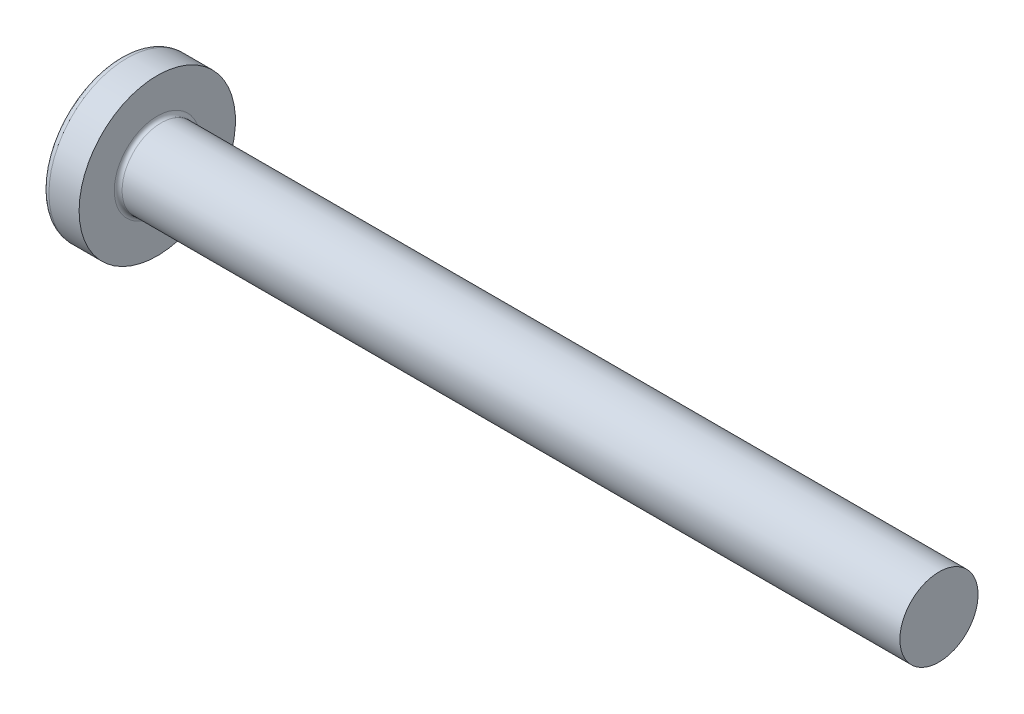
ISO-10303-21;
HEADER;
FILE_DESCRIPTION(('STEP AP214'),'2;1');
FILE_NAME('part.step','',(''),(''),'','','');
FILE_SCHEMA(('AUTOMOTIVE_DESIGN { 1 0 10303 214 1 1 1 1 }'));
ENDSEC;
DATA;
#1=APPLICATION_CONTEXT('core data for automotive mechanical design processes');
#2=APPLICATION_PROTOCOL_DEFINITION('international standard','automotive_design',2000,#1);
#3=PRODUCT_CONTEXT('',#1,'mechanical');
#4=PRODUCT('Part','Part','',(#3));
#5=PRODUCT_RELATED_PRODUCT_CATEGORY('part','',(#4));
#6=PRODUCT_DEFINITION_FORMATION('','',#4);
#7=PRODUCT_DEFINITION_CONTEXT('part definition',#1,'design');
#8=PRODUCT_DEFINITION('design','',#6,#7);
#9=PRODUCT_DEFINITION_SHAPE('','',#8);
#10=(LENGTH_UNIT() NAMED_UNIT(*) SI_UNIT(.MILLI.,.METRE.));
#11=(NAMED_UNIT(*) PLANE_ANGLE_UNIT() SI_UNIT($,.RADIAN.));
#12=(NAMED_UNIT(*) SI_UNIT($,.STERADIAN.) SOLID_ANGLE_UNIT());
#13=UNCERTAINTY_MEASURE_WITH_UNIT(LENGTH_MEASURE(1.E-05),#10,'distance_accuracy_value','');
#14=(GEOMETRIC_REPRESENTATION_CONTEXT(3) GLOBAL_UNCERTAINTY_ASSIGNED_CONTEXT((#13)) GLOBAL_UNIT_ASSIGNED_CONTEXT((#10,
#11,#12)) REPRESENTATION_CONTEXT('',''));
#15=CARTESIAN_POINT('',(0.,0.,0.));
#16=DIRECTION('',(0.,0.,1.));
#17=DIRECTION('',(1.,0.,0.));
#18=AXIS2_PLACEMENT_3D('',#15,#16,#17);
#19=CARTESIAN_POINT('',(6.5,0.,0.));
#20=DIRECTION('',(-1.,0.,0.));
#21=DIRECTION('',(0.,1.,0.));
#22=AXIS2_PLACEMENT_3D('',#19,#20,#21);
#23=SPHERICAL_SURFACE('',#22,6.5);
#24=CARTESIAN_POINT('',(1.26538895452803,0.,0.));
#25=DIRECTION('',(-1.,0.,0.));
#26=DIRECTION('',(0.,0.,1.));
#27=AXIS2_PLACEMENT_3D('',#24,#25,#26);
#28=CIRCLE('',#27,3.85342019543974);
#29=CARTESIAN_POINT('',(1.26538895452803,0.,3.85342019543974));
#30=VERTEX_POINT('',#29);
#31=EDGE_CURVE('E215',#30,#30,#28,.T.);
#32=ORIENTED_EDGE('',*,*,#31,.T.);
#33=EDGE_LOOP('',(#32));
#34=FACE_BOUND('',#33,.T.);
#35=CARTESIAN_POINT('',(0.0788099820016241,0.,0.));
#36=DIRECTION('',(1.,0.,0.));
#37=DIRECTION('',(0.,0.,-1.));
#38=AXIS2_PLACEMENT_3D('',#35,#36,#37);
#39=CIRCLE('',#38,1.0091178091571);
#40=CARTESIAN_POINT('',(0.0788099820016244,-0.514999999999996,-0.867809744562728));
#41=VERTEX_POINT('',#40);
#42=CARTESIAN_POINT('',(0.0788099820016241,-0.867809744562729,-0.515));
#43=VERTEX_POINT('',#42);
#44=EDGE_CURVE('E342',#41,#43,#39,.F.);
#45=ORIENTED_EDGE('',*,*,#44,.F.);
#46=CARTESIAN_POINT('',(6.5,-0.515000000000001,0.));
#47=DIRECTION('',(0.,1.,0.));
#48=DIRECTION('',(0.,0.,1.));
#49=AXIS2_PLACEMENT_3D('',#46,#47,#48);
#50=CIRCLE('',#49,6.47956595768575);
#51=CARTESIAN_POINT('',(0.331830520157854,-0.514999999999992,-1.98455543332603));
#52=VERTEX_POINT('',#51);
#53=EDGE_CURVE('E275',#52,#41,#50,.T.);
#54=ORIENTED_EDGE('',*,*,#53,.F.);
#55=CARTESIAN_POINT('',(6.06443225879603,0.,0.873613881878153));
#56=DIRECTION('',(0.446197753347436,0.,-0.894934391398443));
#57=DIRECTION('',(-0.894934391398442,0.,-0.446197753347436));
#58=AXIS2_PLACEMENT_3D('',#55,#56,#57);
#59=CIRCLE('',#58,6.42628038045433);
#60=CARTESIAN_POINT('',(0.331830520157856,0.515000000000007,-1.98455543332603));
#61=VERTEX_POINT('',#60);
#62=EDGE_CURVE('E249',#52,#61,#59,.T.);
#63=ORIENTED_EDGE('',*,*,#62,.T.);
#64=CARTESIAN_POINT('',(6.5,0.515,0.));
#65=DIRECTION('',(0.,-1.,0.));
#66=DIRECTION('',(0.,0.,-1.));
#67=AXIS2_PLACEMENT_3D('',#64,#65,#66);
#68=CIRCLE('',#67,6.47956595768574);
#69=CARTESIAN_POINT('',(0.0788099820016249,0.515000000000003,-0.867809744562724));
#70=VERTEX_POINT('',#69);
#71=EDGE_CURVE('E304',#70,#61,#68,.T.);
#72=ORIENTED_EDGE('',*,*,#71,.F.);
#73=CARTESIAN_POINT('',(0.0788099820016241,0.867809744562719,-0.515));
#74=VERTEX_POINT('',#73);
#75=EDGE_CURVE('E357',#74,#70,#39,.F.);
#76=ORIENTED_EDGE('',*,*,#75,.F.);
#77=CARTESIAN_POINT('',(6.5,0.,-0.515));
#78=DIRECTION('',(0.,0.,1.));
#79=DIRECTION('',(1.,0.,0.));
#80=AXIS2_PLACEMENT_3D('',#77,#78,#79);
#81=CIRCLE('',#80,6.47956595768574);
#82=CARTESIAN_POINT('',(0.331830520157856,1.98455543332603,-0.515));
#83=VERTEX_POINT('',#82);
#84=EDGE_CURVE('E243',#83,#74,#81,.T.);
#85=ORIENTED_EDGE('',*,*,#84,.F.);
#86=CARTESIAN_POINT('',(6.06443225879604,-0.873613881878154,0.));
#87=DIRECTION('',(0.446197753347436,0.894934391398443,0.));
#88=DIRECTION('',(-0.894934391398442,0.446197753347436,0.));
#89=AXIS2_PLACEMENT_3D('',#86,#87,#88);
#90=CIRCLE('',#89,6.42628038045433);
#91=CARTESIAN_POINT('',(0.331830520157857,1.98455543332603,0.515));
#92=VERTEX_POINT('',#91);
#93=EDGE_CURVE('E246',#83,#92,#90,.T.);
#94=ORIENTED_EDGE('',*,*,#93,.T.);
#95=CARTESIAN_POINT('',(6.5,0.,0.515000000000001));
#96=DIRECTION('',(0.,0.,-1.));
#97=DIRECTION('',(-1.,0.,0.));
#98=AXIS2_PLACEMENT_3D('',#95,#96,#97);
#99=CIRCLE('',#98,6.47956595768574);
#100=CARTESIAN_POINT('',(0.0788099820016241,0.867809744562719,0.514999999999999));
#101=VERTEX_POINT('',#100);
#102=EDGE_CURVE('E239',#101,#92,#99,.T.);
#103=ORIENTED_EDGE('',*,*,#102,.F.);
#104=CARTESIAN_POINT('',(0.0788099820016253,0.514999999999997,0.867809744562727));
#105=VERTEX_POINT('',#104);
#106=EDGE_CURVE('E356',#105,#101,#39,.F.);
#107=ORIENTED_EDGE('',*,*,#106,.F.);
#108=CARTESIAN_POINT('',(0.331830520157856,0.514999999999993,1.98455543332603));
#109=VERTEX_POINT('',#108);
#110=EDGE_CURVE('E259',#109,#105,#68,.T.);
#111=ORIENTED_EDGE('',*,*,#110,.F.);
#112=CARTESIAN_POINT('',(6.06443225879603,0.,-0.873613881878153));
#113=DIRECTION('',(0.446197753347436,0.,0.894934391398443));
#114=DIRECTION('',(0.894934391398442,0.,-0.446197753347436));
#115=AXIS2_PLACEMENT_3D('',#112,#113,#114);
#116=CIRCLE('',#115,6.42628038045433);
#117=CARTESIAN_POINT('',(0.331830520157855,-0.515000000000007,1.98455543332603));
#118=VERTEX_POINT('',#117);
#119=EDGE_CURVE('E50',#109,#118,#116,.T.);
#120=ORIENTED_EDGE('',*,*,#119,.T.);
#121=CARTESIAN_POINT('',(0.0788099820016247,-0.515000000000003,0.867809744562724));
#122=VERTEX_POINT('',#121);
#123=EDGE_CURVE('E256',#122,#118,#50,.T.);
#124=ORIENTED_EDGE('',*,*,#123,.F.);
#125=CARTESIAN_POINT('',(0.0788099820016241,-0.867809744562729,0.514999999999999));
#126=VERTEX_POINT('',#125);
#127=EDGE_CURVE('E392',#126,#122,#39,.F.);
#128=ORIENTED_EDGE('',*,*,#127,.F.);
#129=CARTESIAN_POINT('',(0.331830520157853,-1.98455543332603,0.514999999999999));
#130=VERTEX_POINT('',#129);
#131=EDGE_CURVE('E240',#130,#126,#99,.T.);
#132=ORIENTED_EDGE('',*,*,#131,.F.);
#133=CARTESIAN_POINT('',(6.06443225879603,0.873613881878152,0.));
#134=DIRECTION('',(0.446197753347436,-0.894934391398443,0.));
#135=DIRECTION('',(0.894934391398442,0.446197753347436,0.));
#136=AXIS2_PLACEMENT_3D('',#133,#134,#135);
#137=CIRCLE('',#136,6.42628038045433);
#138=CARTESIAN_POINT('',(0.331830520157853,-1.98455543332603,-0.515));
#139=VERTEX_POINT('',#138);
#140=EDGE_CURVE('E236',#130,#139,#137,.T.);
#141=ORIENTED_EDGE('',*,*,#140,.T.);
#142=EDGE_CURVE('E65',#43,#139,#81,.T.);
#143=ORIENTED_EDGE('',*,*,#142,.F.);
#144=EDGE_LOOP('',(#45,#54,#63,#72,#76,#85,#94,#103,#107,#111,#120,#124,#128,#132,#141,#143));
#145=FACE_BOUND('',#144,.T.);
#146=ADVANCED_FACE('F36',(#34,#145),#23,.T.);
#147=CARTESIAN_POINT('',(0.,2.15,-0.515));
#148=DIRECTION('',(0.,0.,1.));
#149=DIRECTION('',(1.,0.,0.));
#150=AXIS2_PLACEMENT_3D('',#147,#148,#149);
#151=PLANE('',#150);
#152=ORIENTED_EDGE('',*,*,#84,.T.);
#153=CARTESIAN_POINT('',(-1.51195208675156,0.994972220320188,-0.515));
#154=CARTESIAN_POINT('',(-1.20405981949279,0.970722016949958,-0.515));
#155=CARTESIAN_POINT('',(-0.896180907521174,0.946299109919651,-0.515));
#156=CARTESIAN_POINT('',(-0.280449079832185,0.896981122427851,-0.515));
#157=CARTESIAN_POINT('',(0.0274038344396873,0.872086023934883,-0.515));
#158=CARTESIAN_POINT('',(0.489146739515351,0.83429553519528,-0.515));
#159=CARTESIAN_POINT('',(0.643055047553846,0.821624058404092,-0.515));
#160=CARTESIAN_POINT('',(0.950856520197141,0.796108332639504,-0.515));
#161=CARTESIAN_POINT('',(1.10474968487868,0.783264084592465,-0.515));
#162=CARTESIAN_POINT('',(1.41251352095103,0.757376569093378,-0.515));
#163=CARTESIAN_POINT('',(1.56638419296577,0.744333309065218,-0.515));
#164=CARTESIAN_POINT('',(1.87410847343335,0.718013273188896,-0.515));
#165=CARTESIAN_POINT('',(2.02796208151372,0.704736492982792,-0.515));
#166=CARTESIAN_POINT('',(2.36455311890989,0.675386943006726,-0.515));
#167=CARTESIAN_POINT('',(2.54728562293342,0.659257575640986,-0.515));
#168=CARTESIAN_POINT('',(2.91270624109256,0.626517182479888,-0.515));
#169=CARTESIAN_POINT('',(3.09539435554038,0.609906160177238,-0.515));
#170=CARTESIAN_POINT('',(3.46069832191612,0.576073027116421,-0.515));
#171=CARTESIAN_POINT('',(3.64331417870068,0.558850968932727,-0.515));
#172=CARTESIAN_POINT('',(4.00847437496567,0.523604864540037,-0.515));
#173=CARTESIAN_POINT('',(4.19101871216888,0.505580794604253,-0.515));
#174=CARTESIAN_POINT('',(4.55606208157937,0.468429191666488,-0.515));
#175=CARTESIAN_POINT('',(4.73856107358022,0.449301262281854,-0.515));
#176=CARTESIAN_POINT('',(5.10337547353418,0.409473604748924,-0.515));
#177=CARTESIAN_POINT('',(5.28569089526422,0.388774005106069,-0.515));
#178=CARTESIAN_POINT('',(5.55897278495412,0.355828287527264,-0.515));
#179=CARTESIAN_POINT('',(5.65005277419686,0.344527918782738,-0.515));
#180=CARTESIAN_POINT('',(5.83209904103607,0.321075174263031,-0.515));
#181=CARTESIAN_POINT('',(5.92306532397915,0.308922840209686,-0.515));
#182=CARTESIAN_POINT('',(6.10486078872898,0.28342733445193,-0.515));
#183=CARTESIAN_POINT('',(6.19568992299379,0.270083817601714,-0.515));
#184=CARTESIAN_POINT('',(6.33172773785679,0.248701420809951,-0.515));
#185=CARTESIAN_POINT('',(6.37704304473344,0.241345446705304,-0.515));
#186=CARTESIAN_POINT('',(6.4675722520141,0.226018953559337,-0.515));
#187=CARTESIAN_POINT('',(6.51278614568083,0.218048394864476,-0.515));
#188=CARTESIAN_POINT('',(6.55793125759548,0.209691465274944,-0.515));
#189=B_SPLINE_CURVE_WITH_KNOTS('',3,(#153,#154,#155,#156,#157,#158,#159,#160,#161,#162,#163,
#164,#165,#166,#167,#168,#169,#170,#171,#172,#173,#174,#175,#176,#177,#178,#179,#180,#181,#182,
#183,#184,#185,#186,#187,#188),.UNSPECIFIED.,.F.,.F.,(4,2,2,2,2,2,2,2,2,2,2,2,2,2,2,2,2,4),(0.,
0.926537709781721,1.85311087258339,2.31639796016285,2.77968256468771,3.24294992902055,
3.70622594801777,4.25655436065378,4.80687878359543,5.35715597005738,5.90744944680718,
6.45794177197673,7.008389135274,7.28372117336898,7.55903973750591,7.83443833587748,
7.97216007460854,8.10989070671571),.UNSPECIFIED.);
#190=CARTESIAN_POINT('',(2.34,0.677477674908923,-0.515));
#191=VERTEX_POINT('',#190);
#192=EDGE_CURVE('E379',#74,#191,#189,.T.);
#193=ORIENTED_EDGE('',*,*,#192,.T.);
#194=DIRECTION('',(0.,1.,0.));
#195=VECTOR('',#194,1.);
#196=CARTESIAN_POINT('',(2.34,-0.983319232260742,-0.515));
#197=LINE('',#196,#195);
#198=CARTESIAN_POINT('',(2.34,0.983319232260743,-0.515));
#199=VERTEX_POINT('',#198);
#200=EDGE_CURVE('E325',#191,#199,#197,.T.);
#201=ORIENTED_EDGE('',*,*,#200,.T.);
#202=DIRECTION('',(0.894934391398442,-0.446197753347436,0.));
#203=VECTOR('',#202,1.);
#204=CARTESIAN_POINT('',(0.,2.15,-0.515));
#205=LINE('',#204,#203);
#206=EDGE_CURVE('E216',#83,#199,#205,.T.);
#207=ORIENTED_EDGE('',*,*,#206,.F.);
#208=EDGE_LOOP('',(#152,#193,#201,#207));
#209=FACE_BOUND('',#208,.T.);
#210=ADVANCED_FACE('F171',(#209),#151,.T.);
#211=CARTESIAN_POINT('',(2.34,-0.983319232260742,-0.515));
#212=VERTEX_POINT('',#211);
#213=CARTESIAN_POINT('',(2.34,-0.677477674908923,-0.515));
#214=VERTEX_POINT('',#213);
#215=EDGE_CURVE('E224',#212,#214,#197,.T.);
#216=ORIENTED_EDGE('',*,*,#215,.T.);
#217=CARTESIAN_POINT('',(-1.51195208675156,-0.994972220320188,-0.515));
#218=CARTESIAN_POINT('',(-1.20405981949279,-0.970722016949958,-0.515));
#219=CARTESIAN_POINT('',(-0.896180907521174,-0.946299109919651,-0.515));
#220=CARTESIAN_POINT('',(-0.280449079832185,-0.896981122427851,-0.515));
#221=CARTESIAN_POINT('',(0.027403834439687,-0.872086023934883,-0.515));
#222=CARTESIAN_POINT('',(0.48914673951535,-0.83429553519528,-0.515));
#223=CARTESIAN_POINT('',(0.643055047553845,-0.821624058404092,-0.515));
#224=CARTESIAN_POINT('',(0.95085652019714,-0.796108332639504,-0.515));
#225=CARTESIAN_POINT('',(1.10474968487868,-0.783264084592466,-0.515));
#226=CARTESIAN_POINT('',(1.41251352095103,-0.757376569093378,-0.515));
#227=CARTESIAN_POINT('',(1.56638419296577,-0.744333309065218,-0.515));
#228=CARTESIAN_POINT('',(1.87410847343335,-0.718013273188896,-0.515));
#229=CARTESIAN_POINT('',(2.02796208151372,-0.704736492982792,-0.515));
#230=CARTESIAN_POINT('',(2.36455311890989,-0.675386943006726,-0.515));
#231=CARTESIAN_POINT('',(2.54728562293342,-0.659257575640986,-0.515));
#232=CARTESIAN_POINT('',(2.91270624109256,-0.626517182479888,-0.515));
#233=CARTESIAN_POINT('',(3.09539435554038,-0.609906160177238,-0.515));
#234=CARTESIAN_POINT('',(3.46069832191613,-0.576073027116421,-0.515));
#235=CARTESIAN_POINT('',(3.64331417870068,-0.558850968932727,-0.515));
#236=CARTESIAN_POINT('',(4.00847437496567,-0.523604864540037,-0.515));
#237=CARTESIAN_POINT('',(4.19101871216888,-0.505580794604252,-0.515));
#238=CARTESIAN_POINT('',(4.55606208157937,-0.468429191666487,-0.515));
#239=CARTESIAN_POINT('',(4.73856107358023,-0.449301262281853,-0.515));
#240=CARTESIAN_POINT('',(5.10337547353419,-0.409473604748924,-0.515));
#241=CARTESIAN_POINT('',(5.28569089526422,-0.388774005106069,-0.515));
#242=CARTESIAN_POINT('',(5.55897278495412,-0.355828287527264,-0.515));
#243=CARTESIAN_POINT('',(5.65005277419686,-0.344527918782738,-0.515));
#244=CARTESIAN_POINT('',(5.83209904103608,-0.32107517426303,-0.515));
#245=CARTESIAN_POINT('',(5.92306532397915,-0.308922840209685,-0.515));
#246=CARTESIAN_POINT('',(6.10486078872898,-0.283427334451929,-0.515));
#247=CARTESIAN_POINT('',(6.1956899229938,-0.270083817601713,-0.515));
#248=CARTESIAN_POINT('',(6.33172773785679,-0.24870142080995,-0.515));
#249=CARTESIAN_POINT('',(6.37704304473344,-0.241345446705303,-0.515));
#250=CARTESIAN_POINT('',(6.4675722520141,-0.226018953559337,-0.515));
#251=CARTESIAN_POINT('',(6.51278614568083,-0.218048394864475,-0.515));
#252=CARTESIAN_POINT('',(6.55793125759549,-0.209691465274944,-0.515));
#253=B_SPLINE_CURVE_WITH_KNOTS('',3,(#217,#218,#219,#220,#221,#222,#223,#224,#225,#226,#227,
#228,#229,#230,#231,#232,#233,#234,#235,#236,#237,#238,#239,#240,#241,#242,#243,#244,#245,#246,
#247,#248,#249,#250,#251,#252),.UNSPECIFIED.,.F.,.F.,(4,2,2,2,2,2,2,2,2,2,2,2,2,2,2,2,2,4),(0.,
0.926537709781721,1.85311087258339,2.31639796016285,2.77968256468771,3.24294992902054,
3.70622594801777,4.25655436065378,4.80687878359543,5.35715597005738,5.90744944680718,
6.45794177197673,7.008389135274,7.28372117336899,7.55903973750591,7.83443833587749,
7.97216007460855,8.10989070671571),.UNSPECIFIED.);
#254=EDGE_CURVE('E355',#214,#43,#253,.F.);
#255=ORIENTED_EDGE('',*,*,#254,.T.);
#256=ORIENTED_EDGE('',*,*,#142,.T.);
#257=DIRECTION('',(0.894934391398442,0.446197753347436,0.));
#258=VECTOR('',#257,1.);
#259=CARTESIAN_POINT('',(0.,-2.15,-0.515));
#260=LINE('',#259,#258);
#261=EDGE_CURVE('E307',#139,#212,#260,.T.);
#262=ORIENTED_EDGE('',*,*,#261,.T.);
#263=EDGE_LOOP('',(#216,#255,#256,#262));
#264=FACE_BOUND('',#263,.T.);
#265=ADVANCED_FACE('F177',(#264),#151,.T.);
#266=CARTESIAN_POINT('',(0.,-2.15,0.514999999999999));
#267=DIRECTION('',(0.,0.,-1.));
#268=DIRECTION('',(-1.,0.,0.));
#269=AXIS2_PLACEMENT_3D('',#266,#267,#268);
#270=PLANE('',#269);
#271=DIRECTION('',(0.,-1.,0.));
#272=VECTOR('',#271,1.);
#273=CARTESIAN_POINT('',(2.34,0.983319232260742,0.515));
#274=LINE('',#273,#272);
#275=CARTESIAN_POINT('',(2.34,0.983319232260743,0.515));
#276=VERTEX_POINT('',#275);
#277=CARTESIAN_POINT('',(2.34,0.677477674908923,0.515));
#278=VERTEX_POINT('',#277);
#279=EDGE_CURVE('E315',#276,#278,#274,.T.);
#280=ORIENTED_EDGE('',*,*,#279,.T.);
#281=CARTESIAN_POINT('',(-1.51195208675156,0.994972220320188,0.514999999999999));
#282=CARTESIAN_POINT('',(-1.20405981949279,0.970722016949958,0.514999999999999));
#283=CARTESIAN_POINT('',(-0.896180907521173,0.946299109919651,0.514999999999999));
#284=CARTESIAN_POINT('',(-0.280449079832184,0.896981122427852,0.514999999999999));
#285=CARTESIAN_POINT('',(0.0274038344396879,0.872086023934883,0.514999999999999));
#286=CARTESIAN_POINT('',(0.489146739515351,0.83429553519528,0.515));
#287=CARTESIAN_POINT('',(0.643055047553846,0.821624058404092,0.515));
#288=CARTESIAN_POINT('',(0.950856520197141,0.796108332639504,0.515));
#289=CARTESIAN_POINT('',(1.10474968487868,0.783264084592466,0.515));
#290=CARTESIAN_POINT('',(1.41251352095103,0.757376569093379,0.515));
#291=CARTESIAN_POINT('',(1.56638419296577,0.744333309065218,0.515));
#292=CARTESIAN_POINT('',(1.87410847343335,0.718013273188896,0.515));
#293=CARTESIAN_POINT('',(2.02796208151372,0.704736492982792,0.515));
#294=CARTESIAN_POINT('',(2.36455311890989,0.675386943006726,0.515));
#295=CARTESIAN_POINT('',(2.54728562293342,0.659257575640986,0.515));
#296=CARTESIAN_POINT('',(2.91270624109256,0.626517182479888,0.515));
#297=CARTESIAN_POINT('',(3.09539435554038,0.609906160177238,0.515));
#298=CARTESIAN_POINT('',(3.46069832191613,0.576073027116421,0.515));
#299=CARTESIAN_POINT('',(3.64331417870068,0.558850968932727,0.515));
#300=CARTESIAN_POINT('',(4.00847437496567,0.523604864540037,0.515));
#301=CARTESIAN_POINT('',(4.19101871216888,0.505580794604252,0.515));
#302=CARTESIAN_POINT('',(4.55606208157937,0.468429191666487,0.515));
#303=CARTESIAN_POINT('',(4.73856107358023,0.449301262281853,0.515000000000001));
#304=CARTESIAN_POINT('',(5.10337547353419,0.409473604748924,0.515000000000001));
#305=CARTESIAN_POINT('',(5.28569089526422,0.388774005106069,0.515000000000001));
#306=CARTESIAN_POINT('',(5.55897278495412,0.355828287527263,0.515000000000001));
#307=CARTESIAN_POINT('',(5.65005277419686,0.344527918782737,0.515000000000001));
#308=CARTESIAN_POINT('',(5.83209904103608,0.32107517426303,0.515000000000001));
#309=CARTESIAN_POINT('',(5.92306532397915,0.308922840209685,0.515000000000001));
#310=CARTESIAN_POINT('',(6.10486078872898,0.283427334451929,0.515000000000001));
#311=CARTESIAN_POINT('',(6.1956899229938,0.270083817601713,0.515000000000001));
#312=CARTESIAN_POINT('',(6.33172773785679,0.248701420809949,0.515000000000001));
#313=CARTESIAN_POINT('',(6.37704304473344,0.241345446705302,0.515000000000001));
#314=CARTESIAN_POINT('',(6.4675722520141,0.226018953559336,0.515000000000001));
#315=CARTESIAN_POINT('',(6.51278614568083,0.218048394864474,0.515000000000001));
#316=CARTESIAN_POINT('',(6.55793125759549,0.209691465274942,0.515000000000001));
#317=B_SPLINE_CURVE_WITH_KNOTS('',3,(#281,#282,#283,#284,#285,#286,#287,#288,#289,#290,#291,
#292,#293,#294,#295,#296,#297,#298,#299,#300,#301,#302,#303,#304,#305,#306,#307,#308,#309,#310,
#311,#312,#313,#314,#315,#316),.UNSPECIFIED.,.F.,.F.,(4,2,2,2,2,2,2,2,2,2,2,2,2,2,2,2,2,4),(0.,
0.926537709781721,1.85311087258339,2.31639796016285,2.77968256468771,3.24294992902054,
3.70622594801777,4.25655436065378,4.80687878359543,5.35715597005738,5.90744944680718,
6.45794177197673,7.008389135274,7.28372117336899,7.55903973750591,7.83443833587749,
7.97216007460855,8.10989070671571),.UNSPECIFIED.);
#318=EDGE_CURVE('E280',#278,#101,#317,.F.);
#319=ORIENTED_EDGE('',*,*,#318,.T.);
#320=ORIENTED_EDGE('',*,*,#102,.T.);
#321=DIRECTION('',(0.894934391398442,-0.446197753347436,0.));
#322=VECTOR('',#321,1.);
#323=CARTESIAN_POINT('',(0.,2.15,0.515));
#324=LINE('',#323,#322);
#325=EDGE_CURVE('E221',#92,#276,#324,.T.);
#326=ORIENTED_EDGE('',*,*,#325,.T.);
#327=EDGE_LOOP('',(#280,#319,#320,#326));
#328=FACE_BOUND('',#327,.T.);
#329=ADVANCED_FACE('F375',(#328),#270,.T.);
#330=ORIENTED_EDGE('',*,*,#131,.T.);
#331=CARTESIAN_POINT('',(-1.51195208675156,-0.994972220320188,0.514999999999999));
#332=CARTESIAN_POINT('',(-1.20405981949279,-0.970722016949958,0.514999999999999));
#333=CARTESIAN_POINT('',(-0.896180907521174,-0.946299109919651,0.514999999999999));
#334=CARTESIAN_POINT('',(-0.280449079832185,-0.896981122427852,0.514999999999999));
#335=CARTESIAN_POINT('',(0.0274038344396874,-0.872086023934883,0.514999999999999));
#336=CARTESIAN_POINT('',(0.489146739515351,-0.83429553519528,0.514999999999999));
#337=CARTESIAN_POINT('',(0.643055047553846,-0.821624058404092,0.514999999999999));
#338=CARTESIAN_POINT('',(0.950856520197141,-0.796108332639504,0.514999999999999));
#339=CARTESIAN_POINT('',(1.10474968487868,-0.783264084592466,0.515));
#340=CARTESIAN_POINT('',(1.41251352095103,-0.757376569093379,0.515));
#341=CARTESIAN_POINT('',(1.56638419296577,-0.744333309065218,0.515));
#342=CARTESIAN_POINT('',(1.87410847343335,-0.718013273188896,0.515));
#343=CARTESIAN_POINT('',(2.02796208151372,-0.704736492982792,0.515));
#344=CARTESIAN_POINT('',(2.36455311890989,-0.675386943006726,0.515));
#345=CARTESIAN_POINT('',(2.54728562293342,-0.659257575640986,0.515));
#346=CARTESIAN_POINT('',(2.91270624109256,-0.626517182479888,0.515));
#347=CARTESIAN_POINT('',(3.09539435554038,-0.609906160177238,0.515));
#348=CARTESIAN_POINT('',(3.46069832191613,-0.576073027116421,0.515));
#349=CARTESIAN_POINT('',(3.64331417870068,-0.558850968932727,0.515));
#350=CARTESIAN_POINT('',(4.00847437496567,-0.523604864540037,0.515));
#351=CARTESIAN_POINT('',(4.19101871216888,-0.505580794604253,0.515));
#352=CARTESIAN_POINT('',(4.55606208157937,-0.468429191666487,0.515));
#353=CARTESIAN_POINT('',(4.73856107358022,-0.449301262281853,0.515));
#354=CARTESIAN_POINT('',(5.10337547353418,-0.409473604748924,0.515));
#355=CARTESIAN_POINT('',(5.28569089526422,-0.388774005106069,0.515));
#356=CARTESIAN_POINT('',(5.55897278495412,-0.355828287527263,0.515000000000001));
#357=CARTESIAN_POINT('',(5.65005277419686,-0.344527918782738,0.515000000000001));
#358=CARTESIAN_POINT('',(5.83209904103607,-0.32107517426303,0.515000000000001));
#359=CARTESIAN_POINT('',(5.92306532397915,-0.308922840209685,0.515000000000001));
#360=CARTESIAN_POINT('',(6.10486078872898,-0.283427334451929,0.515000000000001));
#361=CARTESIAN_POINT('',(6.19568992299379,-0.270083817601713,0.515000000000001));
#362=CARTESIAN_POINT('',(6.33172773785679,-0.24870142080995,0.515000000000001));
#363=CARTESIAN_POINT('',(6.37704304473344,-0.241345446705303,0.515000000000001));
#364=CARTESIAN_POINT('',(6.4675722520141,-0.226018953559336,0.515000000000001));
#365=CARTESIAN_POINT('',(6.51278614568083,-0.218048394864474,0.515000000000001));
#366=CARTESIAN_POINT('',(6.55793125759549,-0.209691465274943,0.515000000000001));
#367=B_SPLINE_CURVE_WITH_KNOTS('',3,(#331,#332,#333,#334,#335,#336,#337,#338,#339,#340,#341,
#342,#343,#344,#345,#346,#347,#348,#349,#350,#351,#352,#353,#354,#355,#356,#357,#358,#359,#360,
#361,#362,#363,#364,#365,#366),.UNSPECIFIED.,.F.,.F.,(4,2,2,2,2,2,2,2,2,2,2,2,2,2,2,2,2,4),(0.,
0.926537709781721,1.85311087258339,2.31639796016285,2.77968256468771,3.24294992902055,
3.70622594801777,4.25655436065378,4.80687878359543,5.35715597005738,5.90744944680718,
6.45794177197673,7.008389135274,7.28372117336899,7.55903973750591,7.83443833587748,
7.97216007460854,8.10989070671571),.UNSPECIFIED.);
#368=CARTESIAN_POINT('',(2.34,-0.677477674908923,0.515));
#369=VERTEX_POINT('',#368);
#370=EDGE_CURVE('E393',#126,#369,#367,.T.);
#371=ORIENTED_EDGE('',*,*,#370,.T.);
#372=CARTESIAN_POINT('',(2.34,-0.983319232260743,0.515));
#373=VERTEX_POINT('',#372);
#374=EDGE_CURVE('E317',#369,#373,#274,.T.);
#375=ORIENTED_EDGE('',*,*,#374,.T.);
#376=DIRECTION('',(0.894934391398443,0.446197753347436,0.));
#377=VECTOR('',#376,1.);
#378=CARTESIAN_POINT('',(0.,-2.15,0.514999999999999));
#379=LINE('',#378,#377);
#380=EDGE_CURVE('E309',#130,#373,#379,.T.);
#381=ORIENTED_EDGE('',*,*,#380,.F.);
#382=EDGE_LOOP('',(#330,#371,#375,#381));
#383=FACE_BOUND('',#382,.T.);
#384=ADVANCED_FACE('F421',(#383),#270,.T.);
#385=CARTESIAN_POINT('',(2.34,0.983319232260742,-0.515));
#386=DIRECTION('',(-1.,0.,0.));
#387=DIRECTION('',(0.,0.,1.));
#388=AXIS2_PLACEMENT_3D('',#385,#386,#387);
#389=PLANE('',#388);
#390=ORIENTED_EDGE('',*,*,#374,.F.);
#391=CARTESIAN_POINT('',(2.34,0.,0.));
#392=DIRECTION('',(-1.,0.,0.));
#393=DIRECTION('',(0.,0.,1.));
#394=AXIS2_PLACEMENT_3D('',#391,#392,#393);
#395=CIRCLE('',#394,0.851);
#396=EDGE_CURVE('E350',#214,#369,#395,.T.);
#397=ORIENTED_EDGE('',*,*,#396,.F.);
#398=ORIENTED_EDGE('',*,*,#215,.F.);
#399=DIRECTION('',(0.,0.,1.));
#400=VECTOR('',#399,1.);
#401=CARTESIAN_POINT('',(2.34,-0.983319232260742,-0.515));
#402=LINE('',#401,#400);
#403=EDGE_CURVE('E312',#212,#373,#402,.T.);
#404=ORIENTED_EDGE('',*,*,#403,.T.);
#405=EDGE_LOOP('',(#390,#397,#398,#404));
#406=FACE_BOUND('',#405,.T.);
#407=ADVANCED_FACE('F419',(#406),#389,.T.);
#408=DIRECTION('',(0.,0.,-1.));
#409=VECTOR('',#408,1.);
#410=CARTESIAN_POINT('',(2.34,-0.515000000000004,0.983319232260741));
#411=LINE('',#410,#409);
#412=CARTESIAN_POINT('',(2.34,-0.514999999999997,-0.677477674908925));
#413=VERTEX_POINT('',#412);
#414=CARTESIAN_POINT('',(2.34,-0.514999999999996,-0.983319232260744));
#415=VERTEX_POINT('',#414);
#416=EDGE_CURVE('E298',#413,#415,#411,.T.);
#417=ORIENTED_EDGE('',*,*,#416,.F.);
#418=CARTESIAN_POINT('',(2.34,0.515000000000003,-0.677477674908921));
#419=VERTEX_POINT('',#418);
#420=EDGE_CURVE('E57',#419,#413,#395,.T.);
#421=ORIENTED_EDGE('',*,*,#420,.F.);
#422=DIRECTION('',(0.,0.,1.));
#423=VECTOR('',#422,1.);
#424=CARTESIAN_POINT('',(2.34,0.515000000000004,-0.983319232260741));
#425=LINE('',#424,#423);
#426=CARTESIAN_POINT('',(2.34,0.515000000000004,-0.983319232260741));
#427=VERTEX_POINT('',#426);
#428=EDGE_CURVE('E301',#427,#419,#425,.T.);
#429=ORIENTED_EDGE('',*,*,#428,.F.);
#430=DIRECTION('',(0.,-1.,0.));
#431=VECTOR('',#430,1.);
#432=CARTESIAN_POINT('',(2.34,0.515000000000004,-0.983319232260741));
#433=LINE('',#432,#431);
#434=EDGE_CURVE('E292',#427,#415,#433,.T.);
#435=ORIENTED_EDGE('',*,*,#434,.T.);
#436=EDGE_LOOP('',(#417,#421,#429,#435));
#437=FACE_BOUND('',#436,.T.);
#438=ADVANCED_FACE('F345',(#437),#389,.T.);
#439=ORIENTED_EDGE('',*,*,#200,.F.);
#440=EDGE_CURVE('E349',#278,#191,#395,.T.);
#441=ORIENTED_EDGE('',*,*,#440,.F.);
#442=ORIENTED_EDGE('',*,*,#279,.F.);
#443=DIRECTION('',(0.,0.,-1.));
#444=VECTOR('',#443,1.);
#445=CARTESIAN_POINT('',(2.34,0.983319232260742,0.515));
#446=LINE('',#445,#444);
#447=EDGE_CURVE('E318',#276,#199,#446,.T.);
#448=ORIENTED_EDGE('',*,*,#447,.T.);
#449=EDGE_LOOP('',(#439,#441,#442,#448));
#450=FACE_BOUND('',#449,.T.);
#451=ADVANCED_FACE('F428',(#450),#389,.T.);
#452=CARTESIAN_POINT('',(2.34,0.514999999999998,0.677477674908924));
#453=VERTEX_POINT('',#452);
#454=CARTESIAN_POINT('',(2.34,0.514999999999997,0.983319232260744));
#455=VERTEX_POINT('',#454);
#456=EDGE_CURVE('E273',#453,#455,#425,.T.);
#457=ORIENTED_EDGE('',*,*,#456,.F.);
#458=CARTESIAN_POINT('',(2.34,-0.515000000000003,0.677477674908921));
#459=VERTEX_POINT('',#458);
#460=EDGE_CURVE('E353',#459,#453,#395,.T.);
#461=ORIENTED_EDGE('',*,*,#460,.F.);
#462=CARTESIAN_POINT('',(2.34,-0.515000000000004,0.983319232260741));
#463=VERTEX_POINT('',#462);
#464=EDGE_CURVE('E295',#463,#459,#411,.T.);
#465=ORIENTED_EDGE('',*,*,#464,.F.);
#466=DIRECTION('',(0.,1.,0.));
#467=VECTOR('',#466,1.);
#468=CARTESIAN_POINT('',(2.34,-0.515000000000004,0.983319232260741));
#469=LINE('',#468,#467);
#470=EDGE_CURVE('E299',#463,#455,#469,.T.);
#471=ORIENTED_EDGE('',*,*,#470,.T.);
#472=EDGE_LOOP('',(#457,#461,#465,#471));
#473=FACE_BOUND('',#472,.T.);
#474=ADVANCED_FACE('F423',(#473),#389,.T.);
#475=CARTESIAN_POINT('',(0.,0.514999999999993,2.15));
#476=DIRECTION('',(0.,-1.,0.));
#477=DIRECTION('',(1.,0.,0.));
#478=AXIS2_PLACEMENT_3D('',#475,#476,#477);
#479=PLANE('',#478);
#480=ORIENTED_EDGE('',*,*,#110,.T.);
#481=CARTESIAN_POINT('',(-1.51195208675156,0.514999999999997,0.994972220320189));
#482=CARTESIAN_POINT('',(-1.20405981949279,0.514999999999997,0.97072201694996));
#483=CARTESIAN_POINT('',(-0.896180907521173,0.514999999999997,0.946299109919652));
#484=CARTESIAN_POINT('',(-0.280449079832184,0.514999999999997,0.896981122427853));
#485=CARTESIAN_POINT('',(0.0274038344396879,0.514999999999997,0.872086023934884));
#486=CARTESIAN_POINT('',(0.489146739515351,0.514999999999997,0.834295535195282));
#487=CARTESIAN_POINT('',(0.643055047553846,0.514999999999997,0.821624058404094));
#488=CARTESIAN_POINT('',(0.950856520197141,0.514999999999997,0.796108332639506));
#489=CARTESIAN_POINT('',(1.10474968487868,0.514999999999997,0.783264084592467));
#490=CARTESIAN_POINT('',(1.41251352095103,0.514999999999997,0.75737656909338));
#491=CARTESIAN_POINT('',(1.56638419296577,0.514999999999997,0.74433330906522));
#492=CARTESIAN_POINT('',(1.87410847343335,0.514999999999998,0.718013273188897));
#493=CARTESIAN_POINT('',(2.02796208151372,0.514999999999998,0.704736492982794));
#494=CARTESIAN_POINT('',(2.36455311890989,0.514999999999998,0.675386943006728));
#495=CARTESIAN_POINT('',(2.54728562293342,0.514999999999998,0.659257575640987));
#496=CARTESIAN_POINT('',(2.91270624109256,0.514999999999998,0.626517182479889));
#497=CARTESIAN_POINT('',(3.09539435554038,0.514999999999998,0.60990616017724));
#498=CARTESIAN_POINT('',(3.46069832191613,0.514999999999998,0.576073027116423));
#499=CARTESIAN_POINT('',(3.64331417870068,0.514999999999998,0.558850968932729));
#500=CARTESIAN_POINT('',(4.00847437496567,0.514999999999998,0.523604864540039));
#501=CARTESIAN_POINT('',(4.19101871216888,0.514999999999998,0.505580794604254));
#502=CARTESIAN_POINT('',(4.55606208157937,0.514999999999999,0.468429191666489));
#503=CARTESIAN_POINT('',(4.73856107358023,0.514999999999999,0.449301262281855));
#504=CARTESIAN_POINT('',(5.10337547353419,0.514999999999999,0.409473604748926));
#505=CARTESIAN_POINT('',(5.28569089526422,0.514999999999999,0.388774005106071));
#506=CARTESIAN_POINT('',(5.55897278495412,0.514999999999999,0.355828287527265));
#507=CARTESIAN_POINT('',(5.65005277419686,0.514999999999999,0.344527918782739));
#508=CARTESIAN_POINT('',(5.83209904103608,0.514999999999999,0.321075174263032));
#509=CARTESIAN_POINT('',(5.92306532397915,0.514999999999999,0.308922840209687));
#510=CARTESIAN_POINT('',(6.10486078872898,0.514999999999999,0.283427334451931));
#511=CARTESIAN_POINT('',(6.19568992299379,0.514999999999999,0.270083817601715));
#512=CARTESIAN_POINT('',(6.33172773785679,0.514999999999999,0.248701420809952));
#513=CARTESIAN_POINT('',(6.37704304473344,0.514999999999999,0.241345446705305));
#514=CARTESIAN_POINT('',(6.4675722520141,0.514999999999999,0.226018953559339));
#515=CARTESIAN_POINT('',(6.51278614568083,0.514999999999999,0.218048394864478));
#516=CARTESIAN_POINT('',(6.55793125759549,0.515,0.209691465274946));
#517=B_SPLINE_CURVE_WITH_KNOTS('',3,(#481,#482,#483,#484,#485,#486,#487,#488,#489,#490,#491,
#492,#493,#494,#495,#496,#497,#498,#499,#500,#501,#502,#503,#504,#505,#506,#507,#508,#509,#510,
#511,#512,#513,#514,#515,#516),.UNSPECIFIED.,.F.,.F.,(4,2,2,2,2,2,2,2,2,2,2,2,2,2,2,2,2,4),(0.,
0.926537709781721,1.85311087258339,2.31639796016285,2.77968256468771,3.24294992902054,
3.70622594801777,4.25655436065378,4.80687878359543,5.35715597005738,5.90744944680718,
6.45794177197673,7.008389135274,7.28372117336899,7.55903973750591,7.83443833587748,
7.97216007460854,8.10989070671571),.UNSPECIFIED.);
#518=EDGE_CURVE('E442',#105,#453,#517,.T.);
#519=ORIENTED_EDGE('',*,*,#518,.T.);
#520=ORIENTED_EDGE('',*,*,#456,.T.);
#521=DIRECTION('',(0.894934391398442,0.,-0.446197753347436));
#522=VECTOR('',#521,1.);
#523=CARTESIAN_POINT('',(0.,0.514999999999993,2.15));
#524=LINE('',#523,#522);
#525=EDGE_CURVE('E266',#109,#455,#524,.T.);
#526=ORIENTED_EDGE('',*,*,#525,.F.);
#527=EDGE_LOOP('',(#480,#519,#520,#526));
#528=FACE_BOUND('',#527,.T.);
#529=ADVANCED_FACE('F270',(#528),#479,.T.);
#530=CARTESIAN_POINT('',(0.,-0.514999999999992,-2.15));
#531=DIRECTION('',(0.,1.,0.));
#532=DIRECTION('',(-1.,0.,0.));
#533=AXIS2_PLACEMENT_3D('',#530,#531,#532);
#534=PLANE('',#533);
#535=ORIENTED_EDGE('',*,*,#464,.T.);
#536=CARTESIAN_POINT('',(-1.51195208754037,-0.515000000000003,0.994972220382296));
#537=CARTESIAN_POINT('',(-1.20405982018868,-0.515000000000003,0.970722017005062));
#538=CARTESIAN_POINT('',(-0.896180908124144,-0.515000000000003,0.946299109967687));
#539=CARTESIAN_POINT('',(-0.280449080249313,-0.515000000000003,0.896981122461526));
#540=CARTESIAN_POINT('',(0.027403834115485,-0.515000000000003,0.872086023961263));
#541=CARTESIAN_POINT('',(0.489146739371409,-0.515000000000003,0.834295535207135));
#542=CARTESIAN_POINT('',(0.643055047497245,-0.515000000000003,0.821624058408794));
#543=CARTESIAN_POINT('',(0.950856520315204,-0.515000000000003,0.796108332629704));
#544=CARTESIAN_POINT('',(1.10474968508407,-0.515000000000003,0.783264084575316));
#545=CARTESIAN_POINT('',(1.41251352133103,-0.515000000000003,0.757376569061286));
#546=CARTESIAN_POINT('',(1.56638419343305,-0.515000000000003,0.744333309025532));
#547=CARTESIAN_POINT('',(1.87410847407519,-0.515000000000003,0.718013273133714));
#548=CARTESIAN_POINT('',(2.02796208224283,-0.515000000000002,0.704736492919708));
#549=CARTESIAN_POINT('',(2.36455311972626,-0.515000000000002,0.675386942934954));
#550=CARTESIAN_POINT('',(2.5472856237498,-0.515000000000002,0.659257575568566));
#551=CARTESIAN_POINT('',(2.91270624190895,-0.515000000000002,0.626517182406012));
#552=CARTESIAN_POINT('',(3.09539435635676,-0.515000000000002,0.609906160102553));
#553=CARTESIAN_POINT('',(3.46069832273244,-0.515000000000002,0.576073027039887));
#554=CARTESIAN_POINT('',(3.64331417951694,-0.515000000000002,0.558850968855155));
#555=CARTESIAN_POINT('',(4.00847437578178,-0.515000000000002,0.523604864460042));
#556=CARTESIAN_POINT('',(4.1910187129849,-0.515000000000002,0.505580794522874));
#557=CARTESIAN_POINT('',(4.55606208239526,-0.515000000000002,0.468429191581778));
#558=CARTESIAN_POINT('',(4.73856107439606,-0.515000000000002,0.449301262195196));
#559=CARTESIAN_POINT('',(5.10337547434977,-0.515000000000002,0.409473604657433));
#560=CARTESIAN_POINT('',(5.28569089607961,-0.515000000000002,0.388774005011692));
#561=CARTESIAN_POINT('',(5.55897278576906,-0.515000000000002,0.35582828742708));
#562=CARTESIAN_POINT('',(5.65005277501166,-0.515000000000002,0.344527918680366));
#563=CARTESIAN_POINT('',(5.83209904185046,-0.515000000000002,0.321075174155497));
#564=CARTESIAN_POINT('',(5.92306532479326,-0.515000000000002,0.308922840099178));
#565=CARTESIAN_POINT('',(6.10486078954238,-0.515000000000002,0.28342733433415));
#566=CARTESIAN_POINT('',(6.19568992380676,-0.515000000000002,0.270083817479634));
#567=CARTESIAN_POINT('',(6.33172773866873,-0.515000000000002,0.248701420679476));
#568=CARTESIAN_POINT('',(6.37704304554499,-0.515000000000002,0.241345446571704));
#569=CARTESIAN_POINT('',(6.46757225282465,-0.515000000000002,0.22601895341842));
#570=CARTESIAN_POINT('',(6.51278614649077,-0.515000000000002,0.218048394719365));
#571=CARTESIAN_POINT('',(6.55793125840465,-0.515000000000002,0.209691465124898));
#572=B_SPLINE_CURVE_WITH_KNOTS('',3,(#536,#537,#538,#539,#540,#541,#542,#543,#544,#545,#546,
#547,#548,#549,#550,#551,#552,#553,#554,#555,#556,#557,#558,#559,#560,#561,#562,#563,#564,#565,
#566,#567,#568,#569,#570,#571),.UNSPECIFIED.,.F.,.F.,(4,2,2,2,2,2,2,2,2,2,2,2,2,2,2,2,2,4),(0.,
0.926537710061278,1.85311087314258,2.31639796098494,2.77968256577269,3.24294993036838,
3.70622594962848,4.25655436226469,4.80687878520654,5.3571559716686,5.90744944841854,
6.45794177358856,7.00838913688618,7.28372117498157,7.55903973911884,7.83443833749096,
7.97216007622236,8.10989070832989),.UNSPECIFIED.);
#573=EDGE_CURVE('E385',#459,#122,#572,.F.);
#574=ORIENTED_EDGE('',*,*,#573,.T.);
#575=ORIENTED_EDGE('',*,*,#123,.T.);
#576=DIRECTION('',(0.894934391398442,0.,-0.446197753347436));
#577=VECTOR('',#576,1.);
#578=CARTESIAN_POINT('',(0.,-0.515000000000007,2.15));
#579=LINE('',#578,#577);
#580=EDGE_CURVE('E268',#118,#463,#579,.T.);
#581=ORIENTED_EDGE('',*,*,#580,.T.);
#582=EDGE_LOOP('',(#535,#574,#575,#581));
#583=FACE_BOUND('',#582,.T.);
#584=ADVANCED_FACE('F206',(#583),#534,.T.);
#585=ORIENTED_EDGE('',*,*,#428,.T.);
#586=CARTESIAN_POINT('',(-1.51195208754037,0.515000000000004,-0.994972220382296));
#587=CARTESIAN_POINT('',(-1.20405982018868,0.515000000000003,-0.970722017005062));
#588=CARTESIAN_POINT('',(-0.896180908124144,0.515000000000003,-0.946299109967687));
#589=CARTESIAN_POINT('',(-0.280449080249312,0.515000000000003,-0.896981122461525));
#590=CARTESIAN_POINT('',(0.0274038341154851,0.515000000000003,-0.872086023961263));
#591=CARTESIAN_POINT('',(0.489146739371408,0.515000000000003,-0.834295535207134));
#592=CARTESIAN_POINT('',(0.643055047497245,0.515000000000003,-0.821624058408794));
#593=CARTESIAN_POINT('',(0.950856520315203,0.515000000000003,-0.796108332629704));
#594=CARTESIAN_POINT('',(1.10474968508407,0.515000000000003,-0.783264084575316));
#595=CARTESIAN_POINT('',(1.41251352133103,0.515000000000003,-0.757376569061286));
#596=CARTESIAN_POINT('',(1.56638419343305,0.515000000000003,-0.744333309025532));
#597=CARTESIAN_POINT('',(1.87410847407519,0.515000000000003,-0.718013273133714));
#598=CARTESIAN_POINT('',(2.02796208224283,0.515000000000003,-0.704736492919708));
#599=CARTESIAN_POINT('',(2.36455311972626,0.515000000000002,-0.675386942934954));
#600=CARTESIAN_POINT('',(2.5472856237498,0.515000000000002,-0.659257575568566));
#601=CARTESIAN_POINT('',(2.91270624190895,0.515000000000002,-0.626517182406012));
#602=CARTESIAN_POINT('',(3.09539435635676,0.515000000000002,-0.609906160102552));
#603=CARTESIAN_POINT('',(3.46069832273244,0.515000000000002,-0.576073027039887));
#604=CARTESIAN_POINT('',(3.64331417951694,0.515000000000002,-0.558850968855155));
#605=CARTESIAN_POINT('',(4.00847437578178,0.515000000000002,-0.523604864460042));
#606=CARTESIAN_POINT('',(4.1910187129849,0.515000000000002,-0.505580794522874));
#607=CARTESIAN_POINT('',(4.55606208239526,0.515000000000002,-0.468429191581778));
#608=CARTESIAN_POINT('',(4.73856107439606,0.515000000000002,-0.449301262195196));
#609=CARTESIAN_POINT('',(5.10337547434977,0.515000000000002,-0.409473604657433));
#610=CARTESIAN_POINT('',(5.28569089607961,0.515000000000002,-0.388774005011693));
#611=CARTESIAN_POINT('',(5.55897278576906,0.515000000000002,-0.35582828742708));
#612=CARTESIAN_POINT('',(5.65005277501166,0.515000000000001,-0.344527918680367));
#613=CARTESIAN_POINT('',(5.83209904185046,0.515000000000001,-0.321075174155498));
#614=CARTESIAN_POINT('',(5.92306532479326,0.515000000000001,-0.308922840099179));
#615=CARTESIAN_POINT('',(6.10486078954238,0.515000000000001,-0.283427334334151));
#616=CARTESIAN_POINT('',(6.19568992380675,0.515000000000001,-0.270083817479635));
#617=CARTESIAN_POINT('',(6.33172773866873,0.515000000000001,-0.248701420679477));
#618=CARTESIAN_POINT('',(6.37704304554499,0.515000000000001,-0.241345446571705));
#619=CARTESIAN_POINT('',(6.46757225282465,0.515000000000001,-0.226018953418421));
#620=CARTESIAN_POINT('',(6.51278614649077,0.515000000000001,-0.218048394719367));
#621=CARTESIAN_POINT('',(6.55793125840465,0.515000000000001,-0.209691465124899));
#622=B_SPLINE_CURVE_WITH_KNOTS('',3,(#586,#587,#588,#589,#590,#591,#592,#593,#594,#595,#596,
#597,#598,#599,#600,#601,#602,#603,#604,#605,#606,#607,#608,#609,#610,#611,#612,#613,#614,#615,
#616,#617,#618,#619,#620,#621),.UNSPECIFIED.,.F.,.F.,(4,2,2,2,2,2,2,2,2,2,2,2,2,2,2,2,2,4),(0.,
0.926537710061278,1.85311087314258,2.31639796098494,2.77968256577269,3.24294993036838,
3.70622594962848,4.25655436226469,4.80687878520654,5.3571559716686,5.90744944841855,
6.45794177358856,7.00838913688618,7.28372117498156,7.55903973911884,7.83443833749096,
7.97216007622236,8.10989070832989),.UNSPECIFIED.);
#623=EDGE_CURVE('E334',#419,#70,#622,.F.);
#624=ORIENTED_EDGE('',*,*,#623,.T.);
#625=ORIENTED_EDGE('',*,*,#71,.T.);
#626=DIRECTION('',(0.894934391398442,0.,0.446197753347436));
#627=VECTOR('',#626,1.);
#628=CARTESIAN_POINT('',(0.,0.515000000000008,-2.15));
#629=LINE('',#628,#627);
#630=EDGE_CURVE('E277',#61,#427,#629,.T.);
#631=ORIENTED_EDGE('',*,*,#630,.T.);
#632=EDGE_LOOP('',(#585,#624,#625,#631));
#633=FACE_BOUND('',#632,.T.);
#634=ADVANCED_FACE('F204',(#633),#479,.T.);
#635=ORIENTED_EDGE('',*,*,#53,.T.);
#636=CARTESIAN_POINT('',(-1.51195208675156,-0.514999999999996,-0.99497222032019));
#637=CARTESIAN_POINT('',(-1.20405981949279,-0.514999999999996,-0.97072201694996));
#638=CARTESIAN_POINT('',(-0.896180907521174,-0.514999999999996,-0.946299109919653));
#639=CARTESIAN_POINT('',(-0.280449079832186,-0.514999999999996,-0.896981122427854));
#640=CARTESIAN_POINT('',(0.0274038344396869,-0.514999999999996,-0.872086023934885));
#641=CARTESIAN_POINT('',(0.48914673951535,-0.514999999999997,-0.834295535195282));
#642=CARTESIAN_POINT('',(0.643055047553845,-0.514999999999997,-0.821624058404094));
#643=CARTESIAN_POINT('',(0.95085652019714,-0.514999999999997,-0.796108332639506));
#644=CARTESIAN_POINT('',(1.10474968487868,-0.514999999999997,-0.783264084592468));
#645=CARTESIAN_POINT('',(1.41251352095103,-0.514999999999997,-0.757376569093381));
#646=CARTESIAN_POINT('',(1.56638419296577,-0.514999999999997,-0.74433330906522));
#647=CARTESIAN_POINT('',(1.87410847343335,-0.514999999999997,-0.718013273188898));
#648=CARTESIAN_POINT('',(2.02796208151372,-0.514999999999997,-0.704736492982794));
#649=CARTESIAN_POINT('',(2.36455311890989,-0.514999999999998,-0.675386943006728));
#650=CARTESIAN_POINT('',(2.54728562293342,-0.514999999999998,-0.659257575640988));
#651=CARTESIAN_POINT('',(2.91270624109256,-0.514999999999998,-0.62651718247989));
#652=CARTESIAN_POINT('',(3.09539435554038,-0.514999999999998,-0.60990616017724));
#653=CARTESIAN_POINT('',(3.46069832191612,-0.514999999999998,-0.576073027116423));
#654=CARTESIAN_POINT('',(3.64331417870068,-0.514999999999998,-0.558850968932729));
#655=CARTESIAN_POINT('',(4.00847437496567,-0.514999999999998,-0.523604864540039));
#656=CARTESIAN_POINT('',(4.19101871216888,-0.514999999999999,-0.505580794604254));
#657=CARTESIAN_POINT('',(4.55606208157937,-0.514999999999999,-0.468429191666489));
#658=CARTESIAN_POINT('',(4.73856107358022,-0.514999999999999,-0.449301262281855));
#659=CARTESIAN_POINT('',(5.10337547353418,-0.514999999999999,-0.409473604748926));
#660=CARTESIAN_POINT('',(5.28569089526422,-0.514999999999999,-0.388774005106071));
#661=CARTESIAN_POINT('',(5.55897278495412,-0.514999999999999,-0.355828287527265));
#662=CARTESIAN_POINT('',(5.65005277419686,-0.514999999999999,-0.34452791878274));
#663=CARTESIAN_POINT('',(5.83209904103607,-0.515,-0.321075174263032));
#664=CARTESIAN_POINT('',(5.92306532397915,-0.515,-0.308922840209687));
#665=CARTESIAN_POINT('',(6.10486078872898,-0.515,-0.283427334451931));
#666=CARTESIAN_POINT('',(6.19568992299379,-0.515,-0.270083817601715));
#667=CARTESIAN_POINT('',(6.33172773785679,-0.515,-0.248701420809951));
#668=CARTESIAN_POINT('',(6.37704304473344,-0.515,-0.241345446705304));
#669=CARTESIAN_POINT('',(6.4675722520141,-0.515,-0.226018953559338));
#670=CARTESIAN_POINT('',(6.51278614568083,-0.515,-0.218048394864476));
#671=CARTESIAN_POINT('',(6.55793125759548,-0.515,-0.209691465274945));
#672=B_SPLINE_CURVE_WITH_KNOTS('',3,(#636,#637,#638,#639,#640,#641,#642,#643,#644,#645,#646,
#647,#648,#649,#650,#651,#652,#653,#654,#655,#656,#657,#658,#659,#660,#661,#662,#663,#664,#665,
#666,#667,#668,#669,#670,#671),.UNSPECIFIED.,.F.,.F.,(4,2,2,2,2,2,2,2,2,2,2,2,2,2,2,2,2,4),(0.,
0.926537709781721,1.85311087258339,2.31639796016285,2.77968256468771,3.24294992902054,
3.70622594801777,4.25655436065378,4.80687878359543,5.35715597005738,5.90744944680718,
6.45794177197673,7.008389135274,7.28372117336899,7.55903973750591,7.83443833587749,
7.97216007460855,8.10989070671571),.UNSPECIFIED.);
#673=EDGE_CURVE('E11',#41,#413,#672,.T.);
#674=ORIENTED_EDGE('',*,*,#673,.T.);
#675=ORIENTED_EDGE('',*,*,#416,.T.);
#676=DIRECTION('',(0.894934391398443,0.,0.446197753347436));
#677=VECTOR('',#676,1.);
#678=CARTESIAN_POINT('',(0.,-0.514999999999992,-2.15));
#679=LINE('',#678,#677);
#680=EDGE_CURVE('E289',#52,#415,#679,.T.);
#681=ORIENTED_EDGE('',*,*,#680,.F.);
#682=EDGE_LOOP('',(#635,#674,#675,#681));
#683=FACE_BOUND('',#682,.T.);
#684=ADVANCED_FACE('F199',(#683),#534,.T.);
#685=CARTESIAN_POINT('',(-25.4,0.,0.));
#686=DIRECTION('',(-1.,0.,0.));
#687=DIRECTION('',(0.,0.,1.));
#688=AXIS2_PLACEMENT_3D('',#685,#686,#687);
#689=CYLINDRICAL_SURFACE('',#688,2.);
#690=CARTESIAN_POINT('',(3.3,0.,0.));
#691=DIRECTION('',(-1.,0.,0.));
#692=DIRECTION('',(0.,0.,1.));
#693=AXIS2_PLACEMENT_3D('',#690,#691,#692);
#694=CIRCLE('',#693,2.);
#695=CARTESIAN_POINT('',(3.3,0.,2.));
#696=VERTEX_POINT('',#695);
#697=EDGE_CURVE('E210',#696,#696,#694,.F.);
#698=ORIENTED_EDGE('',*,*,#697,.T.);
#699=EDGE_LOOP('',(#698));
#700=FACE_BOUND('',#699,.T.);
#701=CARTESIAN_POINT('',(43.1,0.,0.));
#702=DIRECTION('',(-1.,0.,0.));
#703=DIRECTION('',(0.,0.,1.));
#704=AXIS2_PLACEMENT_3D('',#701,#702,#703);
#705=CIRCLE('',#704,2.);
#706=CARTESIAN_POINT('',(43.1,0.,2.));
#707=VERTEX_POINT('',#706);
#708=EDGE_CURVE('E213',#707,#707,#705,.T.);
#709=ORIENTED_EDGE('',*,*,#708,.T.);
#710=EDGE_LOOP('',(#709));
#711=FACE_BOUND('',#710,.T.);
#712=ADVANCED_FACE('F196',(#700,#711),#689,.T.);
#713=CARTESIAN_POINT('',(3.1,2.,0.));
#714=DIRECTION('',(-1.,0.,0.));
#715=DIRECTION('',(0.,0.,1.));
#716=AXIS2_PLACEMENT_3D('',#713,#714,#715);
#717=PLANE('',#716);
#718=CARTESIAN_POINT('',(3.1,0.,0.));
#719=DIRECTION('',(-1.,0.,0.));
#720=DIRECTION('',(0.,0.,1.));
#721=AXIS2_PLACEMENT_3D('',#718,#719,#720);
#722=CIRCLE('',#721,2.2);
#723=CARTESIAN_POINT('',(3.1,0.,2.2));
#724=VERTEX_POINT('',#723);
#725=EDGE_CURVE('E232',#724,#724,#722,.T.);
#726=ORIENTED_EDGE('',*,*,#725,.T.);
#727=EDGE_LOOP('',(#726));
#728=FACE_BOUND('',#727,.T.);
#729=CARTESIAN_POINT('',(3.1,0.,0.));
#730=DIRECTION('',(-1.,0.,0.));
#731=DIRECTION('',(0.,0.,1.));
#732=AXIS2_PLACEMENT_3D('',#729,#730,#731);
#733=CIRCLE('',#732,4.);
#734=CARTESIAN_POINT('',(3.1,0.,4.));
#735=VERTEX_POINT('',#734);
#736=EDGE_CURVE('E229',#735,#735,#733,.T.);
#737=ORIENTED_EDGE('',*,*,#736,.F.);
#738=EDGE_LOOP('',(#737));
#739=FACE_BOUND('',#738,.T.);
#740=ADVANCED_FACE('F193',(#728,#739),#717,.F.);
#741=CARTESIAN_POINT('',(-25.4,0.,0.));
#742=DIRECTION('',(-1.,0.,0.));
#743=DIRECTION('',(0.,0.,1.));
#744=AXIS2_PLACEMENT_3D('',#741,#742,#743);
#745=CYLINDRICAL_SURFACE('',#744,4.);
#746=ORIENTED_EDGE('',*,*,#736,.T.);
#747=EDGE_LOOP('',(#746));
#748=FACE_BOUND('',#747,.T.);
#749=CARTESIAN_POINT('',(1.55530587396956,0.,0.));
#750=DIRECTION('',(-1.,0.,0.));
#751=DIRECTION('',(0.,0.,1.));
#752=AXIS2_PLACEMENT_3D('',#749,#750,#751);
#753=CIRCLE('',#752,4.);
#754=CARTESIAN_POINT('',(1.55530587396956,0.,4.));
#755=VERTEX_POINT('',#754);
#756=EDGE_CURVE('E218',#755,#755,#753,.T.);
#757=ORIENTED_EDGE('',*,*,#756,.F.);
#758=EDGE_LOOP('',(#757));
#759=FACE_BOUND('',#758,.T.);
#760=ADVANCED_FACE('F189',(#748,#759),#745,.T.);
#761=CARTESIAN_POINT('',(1.55530587396956,0.,0.));
#762=DIRECTION('',(-1.,0.,0.));
#763=DIRECTION('',(0.,0.,1.));
#764=AXIS2_PLACEMENT_3D('',#761,#762,#763);
#765=TOROIDAL_SURFACE('',#764,3.64,0.36);
#766=ORIENTED_EDGE('',*,*,#756,.T.);
#767=EDGE_LOOP('',(#766));
#768=FACE_BOUND('',#767,.T.);
#769=ORIENTED_EDGE('',*,*,#31,.F.);
#770=EDGE_LOOP('',(#769));
#771=FACE_BOUND('',#770,.T.);
#772=ADVANCED_FACE('F186',(#768,#771),#765,.T.);
#773=CARTESIAN_POINT('',(43.1,2.,0.));
#774=DIRECTION('',(1.,0.,0.));
#775=DIRECTION('',(0.,0.,-1.));
#776=AXIS2_PLACEMENT_3D('',#773,#774,#775);
#777=PLANE('',#776);
#778=ORIENTED_EDGE('',*,*,#708,.F.);
#779=EDGE_LOOP('',(#778));
#780=FACE_BOUND('',#779,.T.);
#781=ADVANCED_FACE('F184',(#780),#777,.T.);
#782=CARTESIAN_POINT('',(3.3,0.,0.));
#783=DIRECTION('',(-1.,0.,0.));
#784=DIRECTION('',(0.,0.,1.));
#785=AXIS2_PLACEMENT_3D('',#782,#783,#784);
#786=TOROIDAL_SURFACE('',#785,2.2,0.2);
#787=ORIENTED_EDGE('',*,*,#697,.F.);
#788=EDGE_LOOP('',(#787));
#789=FACE_BOUND('',#788,.T.);
#790=ORIENTED_EDGE('',*,*,#725,.F.);
#791=EDGE_LOOP('',(#790));
#792=FACE_BOUND('',#791,.T.);
#793=ADVANCED_FACE('F38',(#789,#792),#786,.F.);
#794=CARTESIAN_POINT('',(2.34,0.983319232260742,0.515));
#795=DIRECTION('',(0.446197753347436,0.894934391398443,0.));
#796=DIRECTION('',(-0.894934391398442,0.446197753347436,0.));
#797=AXIS2_PLACEMENT_3D('',#794,#795,#796);
#798=PLANE('',#797);
#799=ORIENTED_EDGE('',*,*,#206,.T.);
#800=ORIENTED_EDGE('',*,*,#447,.F.);
#801=ORIENTED_EDGE('',*,*,#325,.F.);
#802=ORIENTED_EDGE('',*,*,#93,.F.);
#803=EDGE_LOOP('',(#799,#800,#801,#802));
#804=FACE_BOUND('',#803,.T.);
#805=ADVANCED_FACE('F373',(#804),#798,.F.);
#806=CARTESIAN_POINT('',(0.,-2.15,-0.515));
#807=DIRECTION('',(0.446197753347436,-0.894934391398443,0.));
#808=DIRECTION('',(0.894934391398442,0.446197753347436,0.));
#809=AXIS2_PLACEMENT_3D('',#806,#807,#808);
#810=PLANE('',#809);
#811=ORIENTED_EDGE('',*,*,#380,.T.);
#812=ORIENTED_EDGE('',*,*,#403,.F.);
#813=ORIENTED_EDGE('',*,*,#261,.F.);
#814=ORIENTED_EDGE('',*,*,#140,.F.);
#815=EDGE_LOOP('',(#811,#812,#813,#814));
#816=FACE_BOUND('',#815,.T.);
#817=ADVANCED_FACE('F410',(#816),#810,.F.);
#818=CARTESIAN_POINT('',(2.34,-0.515000000000004,0.983319232260741));
#819=DIRECTION('',(0.446197753347436,0.,0.894934391398443));
#820=DIRECTION('',(-0.894934391398442,0.,0.446197753347436));
#821=AXIS2_PLACEMENT_3D('',#818,#819,#820);
#822=PLANE('',#821);
#823=ORIENTED_EDGE('',*,*,#525,.T.);
#824=ORIENTED_EDGE('',*,*,#470,.F.);
#825=ORIENTED_EDGE('',*,*,#580,.F.);
#826=ORIENTED_EDGE('',*,*,#119,.F.);
#827=EDGE_LOOP('',(#823,#824,#825,#826));
#828=FACE_BOUND('',#827,.T.);
#829=ADVANCED_FACE('F264',(#828),#822,.F.);
#830=CARTESIAN_POINT('',(0.,0.515000000000008,-2.15));
#831=DIRECTION('',(0.446197753347436,0.,-0.894934391398443));
#832=DIRECTION('',(0.894934391398442,0.,0.446197753347436));
#833=AXIS2_PLACEMENT_3D('',#830,#831,#832);
#834=PLANE('',#833);
#835=ORIENTED_EDGE('',*,*,#680,.T.);
#836=ORIENTED_EDGE('',*,*,#434,.F.);
#837=ORIENTED_EDGE('',*,*,#630,.F.);
#838=ORIENTED_EDGE('',*,*,#62,.F.);
#839=EDGE_LOOP('',(#835,#836,#837,#838));
#840=FACE_BOUND('',#839,.T.);
#841=ADVANCED_FACE('F337',(#840),#834,.F.);
#842=CARTESIAN_POINT('',(2.34,0.,0.));
#843=DIRECTION('',(-1.,0.,0.));
#844=DIRECTION('',(0.,0.,1.));
#845=AXIS2_PLACEMENT_3D('',#842,#843,#844);
#846=CONICAL_SURFACE('',#845,0.851,0.0698131700797659);
#847=EDGE_CURVE('E351',#453,#278,#395,.T.);
#848=ORIENTED_EDGE('',*,*,#847,.F.);
#849=ORIENTED_EDGE('',*,*,#518,.F.);
#850=ORIENTED_EDGE('',*,*,#106,.T.);
#851=ORIENTED_EDGE('',*,*,#318,.F.);
#852=EDGE_LOOP('',(#848,#849,#850,#851));
#853=FACE_BOUND('',#852,.T.);
#854=ADVANCED_FACE('F168',(#853),#846,.F.);
#855=ORIENTED_EDGE('',*,*,#127,.T.);
#856=ORIENTED_EDGE('',*,*,#573,.F.);
#857=EDGE_CURVE('E453',#369,#459,#395,.T.);
#858=ORIENTED_EDGE('',*,*,#857,.F.);
#859=ORIENTED_EDGE('',*,*,#370,.F.);
#860=EDGE_LOOP('',(#855,#856,#858,#859));
#861=FACE_BOUND('',#860,.T.);
#862=ADVANCED_FACE('F408',(#861),#846,.F.);
#863=ORIENTED_EDGE('',*,*,#75,.T.);
#864=ORIENTED_EDGE('',*,*,#623,.F.);
#865=EDGE_CURVE('E346',#191,#419,#395,.T.);
#866=ORIENTED_EDGE('',*,*,#865,.F.);
#867=ORIENTED_EDGE('',*,*,#192,.F.);
#868=EDGE_LOOP('',(#863,#864,#866,#867));
#869=FACE_BOUND('',#868,.T.);
#870=ADVANCED_FACE('F166',(#869),#846,.F.);
#871=EDGE_CURVE('E347',#413,#214,#395,.T.);
#872=ORIENTED_EDGE('',*,*,#871,.F.);
#873=ORIENTED_EDGE('',*,*,#673,.F.);
#874=ORIENTED_EDGE('',*,*,#44,.T.);
#875=ORIENTED_EDGE('',*,*,#254,.F.);
#876=EDGE_LOOP('',(#872,#873,#874,#875));
#877=FACE_BOUND('',#876,.T.);
#878=ADVANCED_FACE('F161',(#877),#846,.F.);
#879=CARTESIAN_POINT('',(2.6165066614942,0.,0.));
#880=DIRECTION('',(-1.,0.,0.));
#881=DIRECTION('',(0.,0.,1.));
#882=AXIS2_PLACEMENT_3D('',#879,#880,#881);
#883=CONICAL_SURFACE('',#882,0.,1.25663706143592);
#884=ORIENTED_EDGE('',*,*,#847,.T.);
#885=ORIENTED_EDGE('',*,*,#440,.T.);
#886=ORIENTED_EDGE('',*,*,#865,.T.);
#887=ORIENTED_EDGE('',*,*,#420,.T.);
#888=ORIENTED_EDGE('',*,*,#871,.T.);
#889=ORIENTED_EDGE('',*,*,#396,.T.);
#890=ORIENTED_EDGE('',*,*,#857,.T.);
#891=ORIENTED_EDGE('',*,*,#460,.T.);
#892=EDGE_LOOP('',(#884,#885,#886,#887,#888,#889,#890,#891));
#893=FACE_BOUND('',#892,.T.);
#894=CARTESIAN_POINT('',(2.6165066614942,0.,0.));
#895=VERTEX_POINT('',#894);
#896=VERTEX_LOOP('',#895);
#897=FACE_BOUND('',#896,.T.);
#898=ADVANCED_FACE('F159',(#893,#897),#883,.F.);
#899=CLOSED_SHELL('',(#146,#210,#265,#329,#384,#407,#438,#451,#474,#529,#584,#634,#684,#712,
#740,#760,#772,#781,#793,#805,#817,#829,#841,#854,#862,#870,#878,#898));
#900=MANIFOLD_SOLID_BREP('B2',#899);
#901=ADVANCED_BREP_SHAPE_REPRESENTATION('',(#18,#900),#14);
#902=SHAPE_DEFINITION_REPRESENTATION(#9,#901);
ENDSEC;
END-ISO-10303-21;
